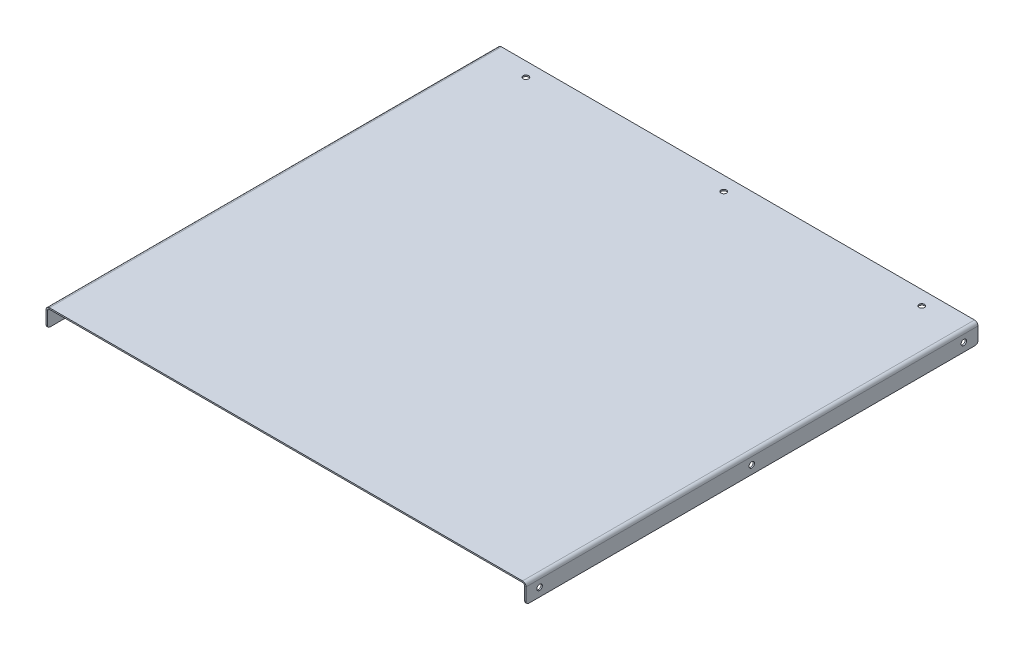
ISO-10303-21;
HEADER;
FILE_DESCRIPTION(('STEP AP214'),'2;1');
FILE_NAME('part.step','',(''),(''),'','','');
FILE_SCHEMA(('AUTOMOTIVE_DESIGN { 1 0 10303 214 1 1 1 1 }'));
ENDSEC;
DATA;
#1=APPLICATION_CONTEXT('core data for automotive mechanical design processes');
#2=APPLICATION_PROTOCOL_DEFINITION('international standard','automotive_design',2000,#1);
#3=PRODUCT_CONTEXT('',#1,'mechanical');
#4=PRODUCT('Part','Part','',(#3));
#5=PRODUCT_RELATED_PRODUCT_CATEGORY('part','',(#4));
#6=PRODUCT_DEFINITION_FORMATION('','',#4);
#7=PRODUCT_DEFINITION_CONTEXT('part definition',#1,'design');
#8=PRODUCT_DEFINITION('design','',#6,#7);
#9=PRODUCT_DEFINITION_SHAPE('','',#8);
#10=(LENGTH_UNIT() NAMED_UNIT(*) SI_UNIT(.MILLI.,.METRE.));
#11=(NAMED_UNIT(*) PLANE_ANGLE_UNIT() SI_UNIT($,.RADIAN.));
#12=(NAMED_UNIT(*) SI_UNIT($,.STERADIAN.) SOLID_ANGLE_UNIT());
#13=UNCERTAINTY_MEASURE_WITH_UNIT(LENGTH_MEASURE(1.E-05),#10,'distance_accuracy_value','');
#14=(GEOMETRIC_REPRESENTATION_CONTEXT(3) GLOBAL_UNCERTAINTY_ASSIGNED_CONTEXT((#13)) GLOBAL_UNIT_ASSIGNED_CONTEXT((#10,
#11,#12)) REPRESENTATION_CONTEXT('',''));
#15=CARTESIAN_POINT('',(0.,0.,0.));
#16=DIRECTION('',(0.,0.,1.));
#17=DIRECTION('',(1.,0.,0.));
#18=AXIS2_PLACEMENT_3D('',#15,#16,#17);
#19=CARTESIAN_POINT('',(-212.4202,0.,0.));
#20=DIRECTION('',(0.,0.,-1.));
#21=DIRECTION('',(-1.,0.,0.));
#22=AXIS2_PLACEMENT_3D('',#19,#20,#21);
#23=PLANE('',#22);
#24=DIRECTION('',(0.,1.,0.));
#25=VECTOR('',#24,1.);
#26=CARTESIAN_POINT('',(-212.4202,0.,0.));
#27=LINE('',#26,#25);
#28=CARTESIAN_POINT('',(-212.4202,0.,0.));
#29=VERTEX_POINT('',#28);
#30=CARTESIAN_POINT('',(-212.4202,1.2192,0.));
#31=VERTEX_POINT('',#30);
#32=EDGE_CURVE('E210',#29,#31,#27,.T.);
#33=ORIENTED_EDGE('',*,*,#32,.F.);
#34=CARTESIAN_POINT('',(-212.4202,-1.905,0.));
#35=DIRECTION('',(0.,0.,1.));
#36=DIRECTION('',(1.,0.,0.));
#37=AXIS2_PLACEMENT_3D('',#34,#35,#36);
#38=CIRCLE('',#37,1.905);
#39=CARTESIAN_POINT('',(-214.3252,-1.905,0.));
#40=VERTEX_POINT('',#39);
#41=EDGE_CURVE('E309',#40,#29,#38,.F.);
#42=ORIENTED_EDGE('',*,*,#41,.F.);
#43=DIRECTION('',(1.,0.,0.));
#44=VECTOR('',#43,1.);
#45=CARTESIAN_POINT('',(-215.5444,-1.905,0.));
#46=LINE('',#45,#44);
#47=CARTESIAN_POINT('',(-215.5444,-1.905,0.));
#48=VERTEX_POINT('',#47);
#49=EDGE_CURVE('E207',#48,#40,#46,.T.);
#50=ORIENTED_EDGE('',*,*,#49,.F.);
#51=CARTESIAN_POINT('',(-212.4202,-1.905,0.));
#52=DIRECTION('',(0.,0.,1.));
#53=DIRECTION('',(1.,0.,0.));
#54=AXIS2_PLACEMENT_3D('',#51,#52,#53);
#55=CIRCLE('',#54,3.1242);
#56=EDGE_CURVE('E302',#48,#31,#55,.F.);
#57=ORIENTED_EDGE('',*,*,#56,.T.);
#58=EDGE_LOOP('',(#33,#42,#50,#57));
#59=FACE_BOUND('',#58,.T.);
#60=ADVANCED_FACE('F36',(#59),#23,.T.);
#61=CARTESIAN_POINT('',(-215.5444,-1.905,0.));
#62=DIRECTION('',(0.,0.,-1.));
#63=DIRECTION('',(-1.,0.,0.));
#64=AXIS2_PLACEMENT_3D('',#61,#62,#63);
#65=PLANE('',#64);
#66=DIRECTION('',(1.,0.,0.));
#67=VECTOR('',#66,1.);
#68=CARTESIAN_POINT('',(-214.3252,0.,0.));
#69=LINE('',#68,#67);
#70=CARTESIAN_POINT('',(212.4202,0.,0.));
#71=VERTEX_POINT('',#70);
#72=EDGE_CURVE('E312',#29,#71,#69,.T.);
#73=ORIENTED_EDGE('',*,*,#72,.F.);
#74=ORIENTED_EDGE('',*,*,#32,.T.);
#75=DIRECTION('',(1.,0.,0.));
#76=VECTOR('',#75,1.);
#77=CARTESIAN_POINT('',(-214.3252,1.2192,0.));
#78=LINE('',#77,#76);
#79=CARTESIAN_POINT('',(212.4202,1.21920000000008,0.));
#80=VERTEX_POINT('',#79);
#81=EDGE_CURVE('E300',#31,#80,#78,.T.);
#82=ORIENTED_EDGE('',*,*,#81,.T.);
#83=DIRECTION('',(0.,-1.,0.));
#84=VECTOR('',#83,1.);
#85=CARTESIAN_POINT('',(212.4202,1.21920000000008,0.));
#86=LINE('',#85,#84);
#87=EDGE_CURVE('E203',#80,#71,#86,.T.);
#88=ORIENTED_EDGE('',*,*,#87,.T.);
#89=EDGE_LOOP('',(#73,#74,#82,#88));
#90=FACE_BOUND('',#89,.T.);
#91=ADVANCED_FACE('F402',(#90),#65,.T.);
#92=CARTESIAN_POINT('',(214.3252,-1.90499999999992,0.));
#93=DIRECTION('',(0.,0.,-1.));
#94=DIRECTION('',(-1.,0.,0.));
#95=AXIS2_PLACEMENT_3D('',#92,#93,#94);
#96=PLANE('',#95);
#97=DIRECTION('',(1.,0.,0.));
#98=VECTOR('',#97,1.);
#99=CARTESIAN_POINT('',(214.3252,-1.90499999999992,0.));
#100=LINE('',#99,#98);
#101=CARTESIAN_POINT('',(214.3252,-1.90499999999992,0.));
#102=VERTEX_POINT('',#101);
#103=CARTESIAN_POINT('',(215.5444,-1.90499999999992,0.));
#104=VERTEX_POINT('',#103);
#105=EDGE_CURVE('E205',#102,#104,#100,.T.);
#106=ORIENTED_EDGE('',*,*,#105,.F.);
#107=CARTESIAN_POINT('',(212.4202,-1.90499999999992,0.));
#108=DIRECTION('',(0.,0.,1.));
#109=DIRECTION('',(1.,0.,0.));
#110=AXIS2_PLACEMENT_3D('',#107,#108,#109);
#111=CIRCLE('',#110,1.905);
#112=EDGE_CURVE('E315',#71,#102,#111,.F.);
#113=ORIENTED_EDGE('',*,*,#112,.F.);
#114=ORIENTED_EDGE('',*,*,#87,.F.);
#115=CARTESIAN_POINT('',(212.4202,-1.90499999999992,0.));
#116=DIRECTION('',(0.,0.,1.));
#117=DIRECTION('',(1.,0.,0.));
#118=AXIS2_PLACEMENT_3D('',#115,#116,#117);
#119=CIRCLE('',#118,3.1242);
#120=EDGE_CURVE('E190',#80,#104,#119,.F.);
#121=ORIENTED_EDGE('',*,*,#120,.T.);
#122=EDGE_LOOP('',(#106,#113,#114,#121));
#123=FACE_BOUND('',#122,.T.);
#124=ADVANCED_FACE('F400',(#123),#96,.T.);
#125=CARTESIAN_POINT('',(212.4202,1.21920000000008,0.));
#126=DIRECTION('',(0.,0.,-1.));
#127=DIRECTION('',(-1.,0.,0.));
#128=AXIS2_PLACEMENT_3D('',#125,#126,#127);
#129=PLANE('',#128);
#130=DIRECTION('',(0.,1.,0.));
#131=VECTOR('',#130,1.);
#132=CARTESIAN_POINT('',(215.5444,0.,0.));
#133=LINE('',#132,#131);
#134=CARTESIAN_POINT('',(215.5444,-13.3349999999999,0.));
#135=VERTEX_POINT('',#134);
#136=EDGE_CURVE('E296',#104,#135,#133,.F.);
#137=ORIENTED_EDGE('',*,*,#136,.T.);
#138=DIRECTION('',(-1.,0.,0.));
#139=VECTOR('',#138,1.);
#140=CARTESIAN_POINT('',(212.4202,-13.3349999999999,0.));
#141=LINE('',#140,#139);
#142=CARTESIAN_POINT('',(214.3252,-13.3349999999999,0.));
#143=VERTEX_POINT('',#142);
#144=EDGE_CURVE('E228',#135,#143,#141,.T.);
#145=ORIENTED_EDGE('',*,*,#144,.T.);
#146=DIRECTION('',(0.,-1.,0.));
#147=VECTOR('',#146,1.);
#148=CARTESIAN_POINT('',(214.3252,0.,0.));
#149=LINE('',#148,#147);
#150=EDGE_CURVE('E293',#102,#143,#149,.T.);
#151=ORIENTED_EDGE('',*,*,#150,.F.);
#152=ORIENTED_EDGE('',*,*,#105,.T.);
#153=EDGE_LOOP('',(#137,#145,#151,#152));
#154=FACE_BOUND('',#153,.T.);
#155=ADVANCED_FACE('F409',(#154),#129,.T.);
#156=CARTESIAN_POINT('',(214.3252,0.,837.827589705481));
#157=DIRECTION('',(1.,0.,0.));
#158=DIRECTION('',(0.,0.,-1.));
#159=AXIS2_PLACEMENT_3D('',#156,#157,#158);
#160=PLANE('',#159);
#161=CARTESIAN_POINT('',(214.3252,-8.30580014757246,12.7));
#162=DIRECTION('',(1.,0.,0.));
#163=DIRECTION('',(0.,0.,-1.));
#164=AXIS2_PLACEMENT_3D('',#161,#162,#163);
#165=CIRCLE('',#164,2.4765);
#166=CARTESIAN_POINT('',(214.3252,-8.30580014757246,10.2235));
#167=VERTEX_POINT('',#166);
#168=EDGE_CURVE('E261',#167,#167,#165,.T.);
#169=ORIENTED_EDGE('',*,*,#168,.T.);
#170=EDGE_LOOP('',(#169));
#171=FACE_BOUND('',#170,.T.);
#172=CARTESIAN_POINT('',(214.3252,-8.30580014757251,203.2));
#173=DIRECTION('',(1.,0.,0.));
#174=DIRECTION('',(0.,0.,-1.));
#175=AXIS2_PLACEMENT_3D('',#172,#173,#174);
#176=CIRCLE('',#175,2.4765);
#177=CARTESIAN_POINT('',(214.3252,-8.30580014757251,200.7235));
#178=VERTEX_POINT('',#177);
#179=EDGE_CURVE('E248',#178,#178,#176,.T.);
#180=ORIENTED_EDGE('',*,*,#179,.T.);
#181=EDGE_LOOP('',(#180));
#182=FACE_BOUND('',#181,.T.);
#183=CARTESIAN_POINT('',(214.3252,-8.30580014757251,393.7));
#184=DIRECTION('',(1.,0.,0.));
#185=DIRECTION('',(0.,0.,-1.));
#186=AXIS2_PLACEMENT_3D('',#183,#184,#185);
#187=CIRCLE('',#186,2.47649999999997);
#188=CARTESIAN_POINT('',(214.3252,-8.30580014757251,391.2235));
#189=VERTEX_POINT('',#188);
#190=EDGE_CURVE('E244',#189,#189,#187,.T.);
#191=ORIENTED_EDGE('',*,*,#190,.T.);
#192=EDGE_LOOP('',(#191));
#193=FACE_BOUND('',#192,.T.);
#194=ORIENTED_EDGE('',*,*,#150,.T.);
#195=CARTESIAN_POINT('',(214.3252,-13.3349999999999,2.54));
#196=DIRECTION('',(1.,0.,0.));
#197=DIRECTION('',(0.,0.,-1.));
#198=AXIS2_PLACEMENT_3D('',#195,#196,#197);
#199=CIRCLE('',#198,2.54);
#200=CARTESIAN_POINT('',(214.3252,-15.8749999999999,2.53999999999999));
#201=VERTEX_POINT('',#200);
#202=EDGE_CURVE('E233',#143,#201,#199,.F.);
#203=ORIENTED_EDGE('',*,*,#202,.T.);
#204=DIRECTION('',(0.,0.,-1.));
#205=VECTOR('',#204,1.);
#206=CARTESIAN_POINT('',(214.3252,-15.8749999999999,837.827589705481));
#207=LINE('',#206,#205);
#208=CARTESIAN_POINT('',(214.3252,-15.8749999999999,403.352000000001));
#209=VERTEX_POINT('',#208);
#210=EDGE_CURVE('E201',#209,#201,#207,.T.);
#211=ORIENTED_EDGE('',*,*,#210,.F.);
#212=CARTESIAN_POINT('',(214.3252,-13.3349999999999,403.352000000001));
#213=DIRECTION('',(1.,0.,0.));
#214=DIRECTION('',(0.,0.,-1.));
#215=AXIS2_PLACEMENT_3D('',#212,#213,#214);
#216=CIRCLE('',#215,2.54);
#217=CARTESIAN_POINT('',(214.3252,-13.3349999999999,405.892000000001));
#218=VERTEX_POINT('',#217);
#219=EDGE_CURVE('E231',#209,#218,#216,.F.);
#220=ORIENTED_EDGE('',*,*,#219,.T.);
#221=DIRECTION('',(0.,1.,0.));
#222=VECTOR('',#221,1.);
#223=CARTESIAN_POINT('',(214.3252,0.,405.892000000001));
#224=LINE('',#223,#222);
#225=CARTESIAN_POINT('',(214.3252,-1.90499999999992,405.892000000001));
#226=VERTEX_POINT('',#225);
#227=EDGE_CURVE('E287',#218,#226,#224,.T.);
#228=ORIENTED_EDGE('',*,*,#227,.T.);
#229=DIRECTION('',(0.,0.,-1.));
#230=VECTOR('',#229,1.);
#231=CARTESIAN_POINT('',(214.3252,-1.90499999999992,837.827589705481));
#232=LINE('',#231,#230);
#233=EDGE_CURVE('E318',#226,#102,#232,.T.);
#234=ORIENTED_EDGE('',*,*,#233,.T.);
#235=EDGE_LOOP('',(#194,#203,#211,#220,#228,#234));
#236=FACE_BOUND('',#235,.T.);
#237=ADVANCED_FACE('F386',(#171,#182,#193,#236),#160,.F.);
#238=CARTESIAN_POINT('',(215.5444,-15.8749999999999,837.827589705481));
#239=DIRECTION('',(0.,-1.,0.));
#240=DIRECTION('',(0.,0.,-1.));
#241=AXIS2_PLACEMENT_3D('',#238,#239,#240);
#242=PLANE('',#241);
#243=ORIENTED_EDGE('',*,*,#210,.T.);
#244=DIRECTION('',(-1.,0.,0.));
#245=VECTOR('',#244,1.);
#246=CARTESIAN_POINT('',(215.5444,-15.8749999999999,2.53999999999999));
#247=LINE('',#246,#245);
#248=CARTESIAN_POINT('',(215.5444,-15.8749999999999,2.53999999999999));
#249=VERTEX_POINT('',#248);
#250=EDGE_CURVE('E61',#201,#249,#247,.F.);
#251=ORIENTED_EDGE('',*,*,#250,.T.);
#252=DIRECTION('',(0.,0.,-1.));
#253=VECTOR('',#252,1.);
#254=CARTESIAN_POINT('',(215.5444,-15.8749999999999,837.827589705481));
#255=LINE('',#254,#253);
#256=CARTESIAN_POINT('',(215.5444,-15.8749999999999,403.352000000001));
#257=VERTEX_POINT('',#256);
#258=EDGE_CURVE('E194',#257,#249,#255,.T.);
#259=ORIENTED_EDGE('',*,*,#258,.F.);
#260=DIRECTION('',(-1.,0.,0.));
#261=VECTOR('',#260,1.);
#262=CARTESIAN_POINT('',(215.5444,-15.8749999999999,403.352000000001));
#263=LINE('',#262,#261);
#264=EDGE_CURVE('E235',#257,#209,#263,.T.);
#265=ORIENTED_EDGE('',*,*,#264,.T.);
#266=EDGE_LOOP('',(#243,#251,#259,#265));
#267=FACE_BOUND('',#266,.T.);
#268=ADVANCED_FACE('F425',(#267),#242,.T.);
#269=CARTESIAN_POINT('',(215.5444,0.,837.827589705481));
#270=DIRECTION('',(1.,0.,0.));
#271=DIRECTION('',(0.,0.,-1.));
#272=AXIS2_PLACEMENT_3D('',#269,#270,#271);
#273=PLANE('',#272);
#274=CARTESIAN_POINT('',(215.5444,-8.30580014757246,12.7));
#275=DIRECTION('',(1.,0.,0.));
#276=DIRECTION('',(0.,0.,-1.));
#277=AXIS2_PLACEMENT_3D('',#274,#275,#276);
#278=CIRCLE('',#277,2.4765);
#279=CARTESIAN_POINT('',(215.5444,-8.30580014757246,10.2235));
#280=VERTEX_POINT('',#279);
#281=EDGE_CURVE('E519',#280,#280,#278,.T.);
#282=ORIENTED_EDGE('',*,*,#281,.F.);
#283=EDGE_LOOP('',(#282));
#284=FACE_BOUND('',#283,.T.);
#285=CARTESIAN_POINT('',(215.5444,-8.30580014757251,203.2));
#286=DIRECTION('',(1.,0.,0.));
#287=DIRECTION('',(0.,0.,-1.));
#288=AXIS2_PLACEMENT_3D('',#285,#286,#287);
#289=CIRCLE('',#288,2.4765);
#290=CARTESIAN_POINT('',(215.5444,-8.30580014757251,200.7235));
#291=VERTEX_POINT('',#290);
#292=EDGE_CURVE('E256',#291,#291,#289,.T.);
#293=ORIENTED_EDGE('',*,*,#292,.F.);
#294=EDGE_LOOP('',(#293));
#295=FACE_BOUND('',#294,.T.);
#296=CARTESIAN_POINT('',(215.5444,-8.30580014757251,393.7));
#297=DIRECTION('',(1.,0.,0.));
#298=DIRECTION('',(0.,0.,-1.));
#299=AXIS2_PLACEMENT_3D('',#296,#297,#298);
#300=CIRCLE('',#299,2.47649999999997);
#301=CARTESIAN_POINT('',(215.5444,-8.30580014757251,391.2235));
#302=VERTEX_POINT('',#301);
#303=EDGE_CURVE('E253',#302,#302,#300,.T.);
#304=ORIENTED_EDGE('',*,*,#303,.F.);
#305=EDGE_LOOP('',(#304));
#306=FACE_BOUND('',#305,.T.);
#307=ORIENTED_EDGE('',*,*,#258,.T.);
#308=CARTESIAN_POINT('',(215.5444,-13.3349999999999,2.54));
#309=DIRECTION('',(1.,0.,0.));
#310=DIRECTION('',(0.,0.,-1.));
#311=AXIS2_PLACEMENT_3D('',#308,#309,#310);
#312=CIRCLE('',#311,2.54);
#313=EDGE_CURVE('E239',#249,#135,#312,.T.);
#314=ORIENTED_EDGE('',*,*,#313,.T.);
#315=ORIENTED_EDGE('',*,*,#136,.F.);
#316=DIRECTION('',(0.,0.,-1.));
#317=VECTOR('',#316,1.);
#318=CARTESIAN_POINT('',(215.5444,-1.90499999999992,837.827589705481));
#319=LINE('',#318,#317);
#320=CARTESIAN_POINT('',(215.5444,-1.90499999999992,405.892000000001));
#321=VERTEX_POINT('',#320);
#322=EDGE_CURVE('E192',#321,#104,#319,.T.);
#323=ORIENTED_EDGE('',*,*,#322,.F.);
#324=DIRECTION('',(0.,1.,0.));
#325=VECTOR('',#324,1.);
#326=CARTESIAN_POINT('',(215.5444,0.,405.892000000001));
#327=LINE('',#326,#325);
#328=CARTESIAN_POINT('',(215.5444,-13.3349999999999,405.892000000001));
#329=VERTEX_POINT('',#328);
#330=EDGE_CURVE('E289',#329,#321,#327,.T.);
#331=ORIENTED_EDGE('',*,*,#330,.F.);
#332=CARTESIAN_POINT('',(215.5444,-13.3349999999999,403.352000000001));
#333=DIRECTION('',(1.,0.,0.));
#334=DIRECTION('',(0.,0.,-1.));
#335=AXIS2_PLACEMENT_3D('',#332,#333,#334);
#336=CIRCLE('',#335,2.54);
#337=EDGE_CURVE('E53',#329,#257,#336,.T.);
#338=ORIENTED_EDGE('',*,*,#337,.T.);
#339=EDGE_LOOP('',(#307,#314,#315,#323,#331,#338));
#340=FACE_BOUND('',#339,.T.);
#341=ADVANCED_FACE('F394',(#284,#295,#306,#340),#273,.T.);
#342=CARTESIAN_POINT('',(212.4202,-1.90499999999992,837.827589705481));
#343=DIRECTION('',(0.,0.,-1.));
#344=DIRECTION('',(-1.,0.,0.));
#345=AXIS2_PLACEMENT_3D('',#342,#343,#344);
#346=CYLINDRICAL_SURFACE('',#345,3.1242);
#347=DIRECTION('',(0.,0.,-1.));
#348=VECTOR('',#347,1.);
#349=CARTESIAN_POINT('',(212.4202,1.21920000000008,837.827589705481));
#350=LINE('',#349,#348);
#351=CARTESIAN_POINT('',(212.4202,1.21920000000008,405.892000000001));
#352=VERTEX_POINT('',#351);
#353=EDGE_CURVE('E183',#352,#80,#350,.T.);
#354=ORIENTED_EDGE('',*,*,#353,.F.);
#355=CARTESIAN_POINT('',(212.4202,-1.90499999999992,405.892000000001));
#356=DIRECTION('',(0.,0.,-1.));
#357=DIRECTION('',(-1.,0.,0.));
#358=AXIS2_PLACEMENT_3D('',#355,#356,#357);
#359=CIRCLE('',#358,3.1242);
#360=EDGE_CURVE('E153',#321,#352,#359,.F.);
#361=ORIENTED_EDGE('',*,*,#360,.F.);
#362=ORIENTED_EDGE('',*,*,#322,.T.);
#363=ORIENTED_EDGE('',*,*,#120,.F.);
#364=EDGE_LOOP('',(#354,#361,#362,#363));
#365=FACE_BOUND('',#364,.T.);
#366=ADVANCED_FACE('F188',(#365),#346,.T.);
#367=CARTESIAN_POINT('',(-214.3252,1.2192,837.827589705481));
#368=DIRECTION('',(0.,1.,0.));
#369=DIRECTION('',(-1.,0.,0.));
#370=AXIS2_PLACEMENT_3D('',#367,#368,#369);
#371=PLANE('',#370);
#372=CARTESIAN_POINT('',(177.8,1.21920000000007,12.7000000000006));
#373=DIRECTION('',(0.,1.,0.));
#374=DIRECTION('',(-1.,0.,0.));
#375=AXIS2_PLACEMENT_3D('',#372,#373,#374);
#376=CIRCLE('',#375,2.4765);
#377=CARTESIAN_POINT('',(175.3235,1.21920000000007,12.7000000000006));
#378=VERTEX_POINT('',#377);
#379=EDGE_CURVE('E505',#378,#378,#376,.T.);
#380=ORIENTED_EDGE('',*,*,#379,.F.);
#381=EDGE_LOOP('',(#380));
#382=FACE_BOUND('',#381,.T.);
#383=CARTESIAN_POINT('',(0.,1.21920000000004,12.7000000000006));
#384=DIRECTION('',(0.,1.,0.));
#385=DIRECTION('',(-1.,0.,0.));
#386=AXIS2_PLACEMENT_3D('',#383,#384,#385);
#387=CIRCLE('',#386,2.4765);
#388=CARTESIAN_POINT('',(-2.47649999999998,1.21920000000004,12.7000000000006));
#389=VERTEX_POINT('',#388);
#390=EDGE_CURVE('E507',#389,#389,#387,.T.);
#391=ORIENTED_EDGE('',*,*,#390,.F.);
#392=EDGE_LOOP('',(#391));
#393=FACE_BOUND('',#392,.T.);
#394=CARTESIAN_POINT('',(-177.8,1.21920000000001,12.7000000000007));
#395=DIRECTION('',(0.,1.,0.));
#396=DIRECTION('',(-1.,0.,0.));
#397=AXIS2_PLACEMENT_3D('',#394,#395,#396);
#398=CIRCLE('',#397,2.4765);
#399=CARTESIAN_POINT('',(-180.2765,1.21920000000001,12.7000000000007));
#400=VERTEX_POINT('',#399);
#401=EDGE_CURVE('E513',#400,#400,#398,.T.);
#402=ORIENTED_EDGE('',*,*,#401,.F.);
#403=EDGE_LOOP('',(#402));
#404=FACE_BOUND('',#403,.T.);
#405=DIRECTION('',(0.,0.,-1.));
#406=VECTOR('',#405,1.);
#407=CARTESIAN_POINT('',(-212.4202,1.2192,837.827589705481));
#408=LINE('',#407,#406);
#409=CARTESIAN_POINT('',(-212.4202,1.2192,405.892000000001));
#410=VERTEX_POINT('',#409);
#411=EDGE_CURVE('E186',#410,#31,#408,.T.);
#412=ORIENTED_EDGE('',*,*,#411,.F.);
#413=DIRECTION('',(-1.,0.,0.));
#414=VECTOR('',#413,1.);
#415=CARTESIAN_POINT('',(-214.3252,1.2192,405.892000000001));
#416=LINE('',#415,#414);
#417=EDGE_CURVE('E171',#352,#410,#416,.T.);
#418=ORIENTED_EDGE('',*,*,#417,.F.);
#419=ORIENTED_EDGE('',*,*,#353,.T.);
#420=ORIENTED_EDGE('',*,*,#81,.F.);
#421=EDGE_LOOP('',(#412,#418,#419,#420));
#422=FACE_BOUND('',#421,.T.);
#423=ADVANCED_FACE('F181',(#382,#393,#404,#422),#371,.T.);
#424=CARTESIAN_POINT('',(-212.4202,-1.905,837.827589705481));
#425=DIRECTION('',(0.,0.,-1.));
#426=DIRECTION('',(-1.,0.,0.));
#427=AXIS2_PLACEMENT_3D('',#424,#425,#426);
#428=CYLINDRICAL_SURFACE('',#427,3.1242);
#429=DIRECTION('',(0.,0.,-1.));
#430=VECTOR('',#429,1.);
#431=CARTESIAN_POINT('',(-215.5444,-1.905,837.827589705481));
#432=LINE('',#431,#430);
#433=CARTESIAN_POINT('',(-215.5444,-1.905,405.892000000001));
#434=VERTEX_POINT('',#433);
#435=EDGE_CURVE('E196',#434,#48,#432,.T.);
#436=ORIENTED_EDGE('',*,*,#435,.F.);
#437=CARTESIAN_POINT('',(-212.4202,-1.905,405.892000000001));
#438=DIRECTION('',(0.,0.,-1.));
#439=DIRECTION('',(-1.,0.,0.));
#440=AXIS2_PLACEMENT_3D('',#437,#438,#439);
#441=CIRCLE('',#440,3.1242);
#442=EDGE_CURVE('E273',#410,#434,#441,.F.);
#443=ORIENTED_EDGE('',*,*,#442,.F.);
#444=ORIENTED_EDGE('',*,*,#411,.T.);
#445=ORIENTED_EDGE('',*,*,#56,.F.);
#446=EDGE_LOOP('',(#436,#443,#444,#445));
#447=FACE_BOUND('',#446,.T.);
#448=ADVANCED_FACE('F344',(#447),#428,.T.);
#449=CARTESIAN_POINT('',(-215.5444,-15.875,837.827589705481));
#450=DIRECTION('',(-1.,0.,0.));
#451=DIRECTION('',(0.,0.,1.));
#452=AXIS2_PLACEMENT_3D('',#449,#450,#451);
#453=PLANE('',#452);
#454=CARTESIAN_POINT('',(-215.5444,-8.30580014757246,12.7));
#455=DIRECTION('',(1.,0.,0.));
#456=DIRECTION('',(0.,0.,-1.));
#457=AXIS2_PLACEMENT_3D('',#454,#455,#456);
#458=CIRCLE('',#457,2.4765);
#459=CARTESIAN_POINT('',(-215.5444,-8.30580014757246,10.2235));
#460=VERTEX_POINT('',#459);
#461=EDGE_CURVE('E522',#460,#460,#458,.T.);
#462=ORIENTED_EDGE('',*,*,#461,.T.);
#463=EDGE_LOOP('',(#462));
#464=FACE_BOUND('',#463,.T.);
#465=CARTESIAN_POINT('',(-215.5444,-8.30580014757251,203.2));
#466=DIRECTION('',(1.,0.,0.));
#467=DIRECTION('',(0.,0.,-1.));
#468=AXIS2_PLACEMENT_3D('',#465,#466,#467);
#469=CIRCLE('',#468,2.4765);
#470=CARTESIAN_POINT('',(-215.5444,-8.30580014757251,200.7235));
#471=VERTEX_POINT('',#470);
#472=EDGE_CURVE('E249',#471,#471,#469,.T.);
#473=ORIENTED_EDGE('',*,*,#472,.T.);
#474=EDGE_LOOP('',(#473));
#475=FACE_BOUND('',#474,.T.);
#476=CARTESIAN_POINT('',(-215.5444,-8.30580014757251,393.7));
#477=DIRECTION('',(1.,0.,0.));
#478=DIRECTION('',(0.,0.,-1.));
#479=AXIS2_PLACEMENT_3D('',#476,#477,#478);
#480=CIRCLE('',#479,2.47649999999997);
#481=CARTESIAN_POINT('',(-215.5444,-8.30580014757251,391.2235));
#482=VERTEX_POINT('',#481);
#483=EDGE_CURVE('E245',#482,#482,#480,.T.);
#484=ORIENTED_EDGE('',*,*,#483,.T.);
#485=EDGE_LOOP('',(#484));
#486=FACE_BOUND('',#485,.T.);
#487=DIRECTION('',(0.,1.,0.));
#488=VECTOR('',#487,1.);
#489=CARTESIAN_POINT('',(-215.5444,-15.875,0.));
#490=LINE('',#489,#488);
#491=CARTESIAN_POINT('',(-215.5444,-13.335,0.));
#492=VERTEX_POINT('',#491);
#493=EDGE_CURVE('E305',#492,#48,#490,.T.);
#494=ORIENTED_EDGE('',*,*,#493,.F.);
#495=CARTESIAN_POINT('',(-215.5444,-13.335,2.54));
#496=DIRECTION('',(-1.,0.,0.));
#497=DIRECTION('',(0.,0.,1.));
#498=AXIS2_PLACEMENT_3D('',#495,#496,#497);
#499=CIRCLE('',#498,2.54);
#500=CARTESIAN_POINT('',(-215.5444,-15.875,2.53999999999999));
#501=VERTEX_POINT('',#500);
#502=EDGE_CURVE('E217',#492,#501,#499,.T.);
#503=ORIENTED_EDGE('',*,*,#502,.T.);
#504=DIRECTION('',(0.,0.,-1.));
#505=VECTOR('',#504,1.);
#506=CARTESIAN_POINT('',(-215.5444,-15.875,837.827589705481));
#507=LINE('',#506,#505);
#508=CARTESIAN_POINT('',(-215.5444,-15.875,403.352000000001));
#509=VERTEX_POINT('',#508);
#510=EDGE_CURVE('E333',#509,#501,#507,.T.);
#511=ORIENTED_EDGE('',*,*,#510,.F.);
#512=CARTESIAN_POINT('',(-215.5444,-13.335,403.352000000001));
#513=DIRECTION('',(-1.,0.,0.));
#514=DIRECTION('',(0.,0.,1.));
#515=AXIS2_PLACEMENT_3D('',#512,#513,#514);
#516=CIRCLE('',#515,2.54);
#517=CARTESIAN_POINT('',(-215.5444,-13.335,405.892000000001));
#518=VERTEX_POINT('',#517);
#519=EDGE_CURVE('E215',#509,#518,#516,.T.);
#520=ORIENTED_EDGE('',*,*,#519,.T.);
#521=DIRECTION('',(0.,1.,0.));
#522=VECTOR('',#521,1.);
#523=CARTESIAN_POINT('',(-215.5444,-15.875,405.892000000001));
#524=LINE('',#523,#522);
#525=EDGE_CURVE('E278',#434,#518,#524,.F.);
#526=ORIENTED_EDGE('',*,*,#525,.F.);
#527=ORIENTED_EDGE('',*,*,#435,.T.);
#528=EDGE_LOOP('',(#494,#503,#511,#520,#526,#527));
#529=FACE_BOUND('',#528,.T.);
#530=ADVANCED_FACE('F341',(#464,#475,#486,#529),#453,.T.);
#531=CARTESIAN_POINT('',(-214.3252,-15.875,837.827589705481));
#532=DIRECTION('',(0.,-1.,0.));
#533=DIRECTION('',(0.,0.,-1.));
#534=AXIS2_PLACEMENT_3D('',#531,#532,#533);
#535=PLANE('',#534);
#536=ORIENTED_EDGE('',*,*,#510,.T.);
#537=DIRECTION('',(-1.,0.,0.));
#538=VECTOR('',#537,1.);
#539=CARTESIAN_POINT('',(-214.3252,-15.875,2.54));
#540=LINE('',#539,#538);
#541=CARTESIAN_POINT('',(-214.3252,-15.875,2.53999999999999));
#542=VERTEX_POINT('',#541);
#543=EDGE_CURVE('E222',#501,#542,#540,.F.);
#544=ORIENTED_EDGE('',*,*,#543,.T.);
#545=DIRECTION('',(0.,0.,-1.));
#546=VECTOR('',#545,1.);
#547=CARTESIAN_POINT('',(-214.3252,-15.875,837.827589705481));
#548=LINE('',#547,#546);
#549=CARTESIAN_POINT('',(-214.3252,-15.875,403.352000000001));
#550=VERTEX_POINT('',#549);
#551=EDGE_CURVE('E330',#550,#542,#548,.T.);
#552=ORIENTED_EDGE('',*,*,#551,.F.);
#553=DIRECTION('',(1.,0.,0.));
#554=VECTOR('',#553,1.);
#555=CARTESIAN_POINT('',(-214.3252,-15.875,403.352000000001));
#556=LINE('',#555,#554);
#557=EDGE_CURVE('E219',#550,#509,#556,.F.);
#558=ORIENTED_EDGE('',*,*,#557,.T.);
#559=EDGE_LOOP('',(#536,#544,#552,#558));
#560=FACE_BOUND('',#559,.T.);
#561=ADVANCED_FACE('F368',(#560),#535,.T.);
#562=CARTESIAN_POINT('',(-214.3252,-15.875,837.827589705481));
#563=DIRECTION('',(-1.,0.,0.));
#564=DIRECTION('',(0.,0.,1.));
#565=AXIS2_PLACEMENT_3D('',#562,#563,#564);
#566=PLANE('',#565);
#567=CARTESIAN_POINT('',(-214.3252,-8.30580014757246,12.7));
#568=DIRECTION('',(-1.,0.,0.));
#569=DIRECTION('',(0.,0.,1.));
#570=AXIS2_PLACEMENT_3D('',#567,#568,#569);
#571=CIRCLE('',#570,2.4765);
#572=CARTESIAN_POINT('',(-214.3252,-8.30580014757246,15.1765));
#573=VERTEX_POINT('',#572);
#574=EDGE_CURVE('E40',#573,#573,#571,.T.);
#575=ORIENTED_EDGE('',*,*,#574,.T.);
#576=EDGE_LOOP('',(#575));
#577=FACE_BOUND('',#576,.T.);
#578=CARTESIAN_POINT('',(-214.3252,-8.30580014757251,203.2));
#579=DIRECTION('',(-1.,0.,0.));
#580=DIRECTION('',(0.,0.,1.));
#581=AXIS2_PLACEMENT_3D('',#578,#579,#580);
#582=CIRCLE('',#581,2.4765);
#583=CARTESIAN_POINT('',(-214.3252,-8.30580014757251,205.6765));
#584=VERTEX_POINT('',#583);
#585=EDGE_CURVE('E246',#584,#584,#582,.T.);
#586=ORIENTED_EDGE('',*,*,#585,.T.);
#587=EDGE_LOOP('',(#586));
#588=FACE_BOUND('',#587,.T.);
#589=CARTESIAN_POINT('',(-214.3252,-8.30580014757251,393.7));
#590=DIRECTION('',(-1.,0.,0.));
#591=DIRECTION('',(0.,0.,1.));
#592=AXIS2_PLACEMENT_3D('',#589,#590,#591);
#593=CIRCLE('',#592,2.47649999999997);
#594=CARTESIAN_POINT('',(-214.3252,-8.30580014757251,396.1765));
#595=VERTEX_POINT('',#594);
#596=EDGE_CURVE('E242',#595,#595,#593,.T.);
#597=ORIENTED_EDGE('',*,*,#596,.T.);
#598=EDGE_LOOP('',(#597));
#599=FACE_BOUND('',#598,.T.);
#600=ORIENTED_EDGE('',*,*,#551,.T.);
#601=CARTESIAN_POINT('',(-214.3252,-13.335,2.54));
#602=DIRECTION('',(-1.,0.,0.));
#603=DIRECTION('',(0.,0.,1.));
#604=AXIS2_PLACEMENT_3D('',#601,#602,#603);
#605=CIRCLE('',#604,2.54);
#606=CARTESIAN_POINT('',(-214.3252,-13.335,0.));
#607=VERTEX_POINT('',#606);
#608=EDGE_CURVE('E226',#542,#607,#605,.F.);
#609=ORIENTED_EDGE('',*,*,#608,.T.);
#610=DIRECTION('',(0.,1.,0.));
#611=VECTOR('',#610,1.);
#612=CARTESIAN_POINT('',(-214.3252,-15.875,0.));
#613=LINE('',#612,#611);
#614=EDGE_CURVE('E307',#607,#40,#613,.T.);
#615=ORIENTED_EDGE('',*,*,#614,.T.);
#616=DIRECTION('',(0.,0.,-1.));
#617=VECTOR('',#616,1.);
#618=CARTESIAN_POINT('',(-214.3252,-1.905,837.827589705481));
#619=LINE('',#618,#617);
#620=CARTESIAN_POINT('',(-214.3252,-1.905,405.892000000001));
#621=VERTEX_POINT('',#620);
#622=EDGE_CURVE('E327',#621,#40,#619,.T.);
#623=ORIENTED_EDGE('',*,*,#622,.F.);
#624=DIRECTION('',(0.,-1.,0.));
#625=VECTOR('',#624,1.);
#626=CARTESIAN_POINT('',(-214.3252,-15.875,405.892000000001));
#627=LINE('',#626,#625);
#628=CARTESIAN_POINT('',(-214.3252,-13.335,405.892000000001));
#629=VERTEX_POINT('',#628);
#630=EDGE_CURVE('E275',#621,#629,#627,.T.);
#631=ORIENTED_EDGE('',*,*,#630,.T.);
#632=CARTESIAN_POINT('',(-214.3252,-13.335,403.352000000001));
#633=DIRECTION('',(-1.,0.,0.));
#634=DIRECTION('',(0.,0.,1.));
#635=AXIS2_PLACEMENT_3D('',#632,#633,#634);
#636=CIRCLE('',#635,2.54);
#637=EDGE_CURVE('E224',#629,#550,#636,.F.);
#638=ORIENTED_EDGE('',*,*,#637,.T.);
#639=EDGE_LOOP('',(#600,#609,#615,#623,#631,#638));
#640=FACE_BOUND('',#639,.T.);
#641=ADVANCED_FACE('F359',(#577,#588,#599,#640),#566,.F.);
#642=CARTESIAN_POINT('',(-212.4202,-1.905,837.827589705481));
#643=DIRECTION('',(0.,0.,-1.));
#644=DIRECTION('',(-1.,0.,0.));
#645=AXIS2_PLACEMENT_3D('',#642,#643,#644);
#646=CYLINDRICAL_SURFACE('',#645,1.905);
#647=CARTESIAN_POINT('',(-212.4202,-1.905,405.892000000001));
#648=DIRECTION('',(0.,0.,-1.));
#649=DIRECTION('',(-1.,0.,0.));
#650=AXIS2_PLACEMENT_3D('',#647,#648,#649);
#651=CIRCLE('',#650,1.905);
#652=CARTESIAN_POINT('',(-212.4202,0.,405.892000000001));
#653=VERTEX_POINT('',#652);
#654=EDGE_CURVE('E165',#653,#621,#651,.F.);
#655=ORIENTED_EDGE('',*,*,#654,.T.);
#656=ORIENTED_EDGE('',*,*,#622,.T.);
#657=ORIENTED_EDGE('',*,*,#41,.T.);
#658=DIRECTION('',(0.,0.,-1.));
#659=VECTOR('',#658,1.);
#660=CARTESIAN_POINT('',(-212.4202,0.,837.827589705481));
#661=LINE('',#660,#659);
#662=EDGE_CURVE('E324',#653,#29,#661,.T.);
#663=ORIENTED_EDGE('',*,*,#662,.F.);
#664=EDGE_LOOP('',(#655,#656,#657,#663));
#665=FACE_BOUND('',#664,.T.);
#666=ADVANCED_FACE('F354',(#665),#646,.F.);
#667=CARTESIAN_POINT('',(-214.3252,0.,837.827589705481));
#668=DIRECTION('',(0.,1.,0.));
#669=DIRECTION('',(-1.,0.,0.));
#670=AXIS2_PLACEMENT_3D('',#667,#668,#669);
#671=PLANE('',#670);
#672=CARTESIAN_POINT('',(177.8,0.,12.7000000000006));
#673=DIRECTION('',(0.,1.,0.));
#674=DIRECTION('',(-1.,0.,0.));
#675=AXIS2_PLACEMENT_3D('',#672,#673,#674);
#676=CIRCLE('',#675,2.4765);
#677=CARTESIAN_POINT('',(175.3235,0.,12.7000000000006));
#678=VERTEX_POINT('',#677);
#679=EDGE_CURVE('E502',#678,#678,#676,.T.);
#680=ORIENTED_EDGE('',*,*,#679,.T.);
#681=EDGE_LOOP('',(#680));
#682=FACE_BOUND('',#681,.T.);
#683=CARTESIAN_POINT('',(0.,0.,12.7000000000006));
#684=DIRECTION('',(0.,1.,0.));
#685=DIRECTION('',(-1.,0.,0.));
#686=AXIS2_PLACEMENT_3D('',#683,#684,#685);
#687=CIRCLE('',#686,2.4765);
#688=CARTESIAN_POINT('',(-2.47649999999998,0.,12.7000000000006));
#689=VERTEX_POINT('',#688);
#690=EDGE_CURVE('E510',#689,#689,#687,.T.);
#691=ORIENTED_EDGE('',*,*,#690,.T.);
#692=EDGE_LOOP('',(#691));
#693=FACE_BOUND('',#692,.T.);
#694=CARTESIAN_POINT('',(-177.8,0.,12.7000000000007));
#695=DIRECTION('',(0.,1.,0.));
#696=DIRECTION('',(-1.,0.,0.));
#697=AXIS2_PLACEMENT_3D('',#694,#695,#696);
#698=CIRCLE('',#697,2.4765);
#699=CARTESIAN_POINT('',(-180.2765,0.,12.7000000000007));
#700=VERTEX_POINT('',#699);
#701=EDGE_CURVE('E516',#700,#700,#698,.T.);
#702=ORIENTED_EDGE('',*,*,#701,.T.);
#703=EDGE_LOOP('',(#702));
#704=FACE_BOUND('',#703,.T.);
#705=DIRECTION('',(-1.,0.,0.));
#706=VECTOR('',#705,1.);
#707=CARTESIAN_POINT('',(-214.3252,0.,405.892000000001));
#708=LINE('',#707,#706);
#709=CARTESIAN_POINT('',(212.4202,0.,405.892000000001));
#710=VERTEX_POINT('',#709);
#711=EDGE_CURVE('E174',#710,#653,#708,.T.);
#712=ORIENTED_EDGE('',*,*,#711,.T.);
#713=ORIENTED_EDGE('',*,*,#662,.T.);
#714=ORIENTED_EDGE('',*,*,#72,.T.);
#715=DIRECTION('',(0.,0.,-1.));
#716=VECTOR('',#715,1.);
#717=CARTESIAN_POINT('',(212.4202,0.,837.827589705481));
#718=LINE('',#717,#716);
#719=EDGE_CURVE('E321',#710,#71,#718,.T.);
#720=ORIENTED_EDGE('',*,*,#719,.F.);
#721=EDGE_LOOP('',(#712,#713,#714,#720));
#722=FACE_BOUND('',#721,.T.);
#723=ADVANCED_FACE('F379',(#682,#693,#704,#722),#671,.F.);
#724=CARTESIAN_POINT('',(212.4202,-1.90499999999992,837.827589705481));
#725=DIRECTION('',(0.,0.,-1.));
#726=DIRECTION('',(-1.,0.,0.));
#727=AXIS2_PLACEMENT_3D('',#724,#725,#726);
#728=CYLINDRICAL_SURFACE('',#727,1.905);
#729=CARTESIAN_POINT('',(212.4202,-1.90499999999992,405.892000000001));
#730=DIRECTION('',(0.,0.,-1.));
#731=DIRECTION('',(-1.,0.,0.));
#732=AXIS2_PLACEMENT_3D('',#729,#730,#731);
#733=CIRCLE('',#732,1.905);
#734=EDGE_CURVE('E166',#226,#710,#733,.F.);
#735=ORIENTED_EDGE('',*,*,#734,.T.);
#736=ORIENTED_EDGE('',*,*,#719,.T.);
#737=ORIENTED_EDGE('',*,*,#112,.T.);
#738=ORIENTED_EDGE('',*,*,#233,.F.);
#739=EDGE_LOOP('',(#735,#736,#737,#738));
#740=FACE_BOUND('',#739,.T.);
#741=ADVANCED_FACE('F382',(#740),#728,.F.);
#742=CARTESIAN_POINT('',(212.4202,-1.90499999999992,0.));
#743=DIRECTION('',(0.,0.,1.));
#744=DIRECTION('',(1.,0.,0.));
#745=AXIS2_PLACEMENT_3D('',#742,#743,#744);
#746=PLANE('',#745);
#747=ORIENTED_EDGE('',*,*,#614,.F.);
#748=DIRECTION('',(-1.,0.,0.));
#749=VECTOR('',#748,1.);
#750=CARTESIAN_POINT('',(-215.5444,-13.335,0.));
#751=LINE('',#750,#749);
#752=EDGE_CURVE('E212',#607,#492,#751,.T.);
#753=ORIENTED_EDGE('',*,*,#752,.T.);
#754=ORIENTED_EDGE('',*,*,#493,.T.);
#755=ORIENTED_EDGE('',*,*,#49,.T.);
#756=EDGE_LOOP('',(#747,#753,#754,#755));
#757=FACE_BOUND('',#756,.T.);
#758=ADVANCED_FACE('F350',(#757),#746,.F.);
#759=CARTESIAN_POINT('',(214.3252,0.,405.892000000001));
#760=DIRECTION('',(0.,0.,-1.));
#761=DIRECTION('',(0.,1.,0.));
#762=AXIS2_PLACEMENT_3D('',#759,#760,#761);
#763=PLANE('',#762);
#764=ORIENTED_EDGE('',*,*,#227,.F.);
#765=DIRECTION('',(1.,0.,0.));
#766=VECTOR('',#765,1.);
#767=CARTESIAN_POINT('',(214.3252,-13.3349999999999,405.892000000001));
#768=LINE('',#767,#766);
#769=EDGE_CURVE('E45',#218,#329,#768,.T.);
#770=ORIENTED_EDGE('',*,*,#769,.T.);
#771=ORIENTED_EDGE('',*,*,#330,.T.);
#772=DIRECTION('',(-1.,0.,0.));
#773=VECTOR('',#772,1.);
#774=CARTESIAN_POINT('',(214.3252,-1.90499999999992,405.892000000001));
#775=LINE('',#774,#773);
#776=EDGE_CURVE('E160',#226,#321,#775,.F.);
#777=ORIENTED_EDGE('',*,*,#776,.F.);
#778=EDGE_LOOP('',(#764,#770,#771,#777));
#779=FACE_BOUND('',#778,.T.);
#780=ADVANCED_FACE('F391',(#779),#763,.F.);
#781=CARTESIAN_POINT('',(-214.3252,0.,405.892000000001));
#782=DIRECTION('',(0.,0.,-1.));
#783=DIRECTION('',(-1.,0.,0.));
#784=AXIS2_PLACEMENT_3D('',#781,#782,#783);
#785=PLANE('',#784);
#786=DIRECTION('',(0.,-1.,0.));
#787=VECTOR('',#786,1.);
#788=CARTESIAN_POINT('',(-212.4202,0.,405.892000000001));
#789=LINE('',#788,#787);
#790=EDGE_CURVE('E176',#653,#410,#789,.F.);
#791=ORIENTED_EDGE('',*,*,#790,.F.);
#792=ORIENTED_EDGE('',*,*,#711,.F.);
#793=DIRECTION('',(0.,-1.,0.));
#794=VECTOR('',#793,1.);
#795=CARTESIAN_POINT('',(212.4202,0.,405.892000000001));
#796=LINE('',#795,#794);
#797=EDGE_CURVE('E157',#710,#352,#796,.F.);
#798=ORIENTED_EDGE('',*,*,#797,.T.);
#799=ORIENTED_EDGE('',*,*,#417,.T.);
#800=EDGE_LOOP('',(#791,#792,#798,#799));
#801=FACE_BOUND('',#800,.T.);
#802=ADVANCED_FACE('F170',(#801),#785,.F.);
#803=CARTESIAN_POINT('',(-214.3252,-15.875,405.892000000001));
#804=DIRECTION('',(0.,0.,-1.));
#805=DIRECTION('',(0.,-1.,0.));
#806=AXIS2_PLACEMENT_3D('',#803,#804,#805);
#807=PLANE('',#806);
#808=ORIENTED_EDGE('',*,*,#525,.T.);
#809=DIRECTION('',(-1.,0.,0.));
#810=VECTOR('',#809,1.);
#811=CARTESIAN_POINT('',(-214.3252,-13.335,405.892000000001));
#812=LINE('',#811,#810);
#813=EDGE_CURVE('E11',#518,#629,#812,.F.);
#814=ORIENTED_EDGE('',*,*,#813,.T.);
#815=ORIENTED_EDGE('',*,*,#630,.F.);
#816=DIRECTION('',(1.,0.,0.));
#817=VECTOR('',#816,1.);
#818=CARTESIAN_POINT('',(-214.3252,-1.905,405.892000000001));
#819=LINE('',#818,#817);
#820=EDGE_CURVE('E281',#621,#434,#819,.F.);
#821=ORIENTED_EDGE('',*,*,#820,.T.);
#822=EDGE_LOOP('',(#808,#814,#815,#821));
#823=FACE_BOUND('',#822,.T.);
#824=ADVANCED_FACE('F373',(#823),#807,.F.);
#825=CARTESIAN_POINT('',(-212.4202,-1.905,405.892000000001));
#826=DIRECTION('',(0.,0.,1.));
#827=DIRECTION('',(1.,0.,0.));
#828=AXIS2_PLACEMENT_3D('',#825,#826,#827);
#829=PLANE('',#828);
#830=ORIENTED_EDGE('',*,*,#820,.F.);
#831=ORIENTED_EDGE('',*,*,#654,.F.);
#832=ORIENTED_EDGE('',*,*,#790,.T.);
#833=ORIENTED_EDGE('',*,*,#442,.T.);
#834=EDGE_LOOP('',(#830,#831,#832,#833));
#835=FACE_BOUND('',#834,.T.);
#836=ADVANCED_FACE('F376',(#835),#829,.T.);
#837=CARTESIAN_POINT('',(212.4202,-1.90499999999992,405.892000000001));
#838=DIRECTION('',(0.,0.,1.));
#839=DIRECTION('',(1.,0.,0.));
#840=AXIS2_PLACEMENT_3D('',#837,#838,#839);
#841=PLANE('',#840);
#842=ORIENTED_EDGE('',*,*,#797,.F.);
#843=ORIENTED_EDGE('',*,*,#734,.F.);
#844=ORIENTED_EDGE('',*,*,#776,.T.);
#845=ORIENTED_EDGE('',*,*,#360,.T.);
#846=EDGE_LOOP('',(#842,#843,#844,#845));
#847=FACE_BOUND('',#846,.T.);
#848=ADVANCED_FACE('F155',(#847),#841,.T.);
#849=CARTESIAN_POINT('',(212.4202,-13.335,2.54));
#850=DIRECTION('',(1.,0.,0.));
#851=DIRECTION('',(0.,0.,-1.));
#852=AXIS2_PLACEMENT_3D('',#849,#850,#851);
#853=CYLINDRICAL_SURFACE('',#852,2.54);
#854=ORIENTED_EDGE('',*,*,#608,.F.);
#855=ORIENTED_EDGE('',*,*,#543,.F.);
#856=ORIENTED_EDGE('',*,*,#502,.F.);
#857=ORIENTED_EDGE('',*,*,#752,.F.);
#858=EDGE_LOOP('',(#854,#855,#856,#857));
#859=FACE_BOUND('',#858,.T.);
#860=ADVANCED_FACE('F365',(#859),#853,.T.);
#861=CARTESIAN_POINT('',(212.4202,-13.3349999999999,2.54));
#862=DIRECTION('',(-1.,0.,0.));
#863=DIRECTION('',(0.,0.,1.));
#864=AXIS2_PLACEMENT_3D('',#861,#862,#863);
#865=CYLINDRICAL_SURFACE('',#864,2.54);
#866=ORIENTED_EDGE('',*,*,#313,.F.);
#867=ORIENTED_EDGE('',*,*,#250,.F.);
#868=ORIENTED_EDGE('',*,*,#202,.F.);
#869=ORIENTED_EDGE('',*,*,#144,.F.);
#870=EDGE_LOOP('',(#866,#867,#868,#869));
#871=FACE_BOUND('',#870,.T.);
#872=ADVANCED_FACE('F416',(#871),#865,.T.);
#873=CARTESIAN_POINT('',(214.3252,-13.3349999999999,403.352000000001));
#874=DIRECTION('',(-1.,0.,0.));
#875=DIRECTION('',(0.,0.,1.));
#876=AXIS2_PLACEMENT_3D('',#873,#874,#875);
#877=CYLINDRICAL_SURFACE('',#876,2.54);
#878=ORIENTED_EDGE('',*,*,#219,.F.);
#879=ORIENTED_EDGE('',*,*,#264,.F.);
#880=ORIENTED_EDGE('',*,*,#337,.F.);
#881=ORIENTED_EDGE('',*,*,#769,.F.);
#882=EDGE_LOOP('',(#878,#879,#880,#881));
#883=FACE_BOUND('',#882,.T.);
#884=ADVANCED_FACE('F418',(#883),#877,.T.);
#885=CARTESIAN_POINT('',(-214.3252,-13.335,403.352000000001));
#886=DIRECTION('',(1.,0.,0.));
#887=DIRECTION('',(0.,0.,-1.));
#888=AXIS2_PLACEMENT_3D('',#885,#886,#887);
#889=CYLINDRICAL_SURFACE('',#888,2.54);
#890=ORIENTED_EDGE('',*,*,#637,.F.);
#891=ORIENTED_EDGE('',*,*,#813,.F.);
#892=ORIENTED_EDGE('',*,*,#519,.F.);
#893=ORIENTED_EDGE('',*,*,#557,.F.);
#894=EDGE_LOOP('',(#890,#891,#892,#893));
#895=FACE_BOUND('',#894,.T.);
#896=ADVANCED_FACE('F38',(#895),#889,.T.);
#897=CARTESIAN_POINT('',(-215.5444,-8.30580014757251,393.7));
#898=DIRECTION('',(1.,0.,0.));
#899=DIRECTION('',(0.,0.,-1.));
#900=AXIS2_PLACEMENT_3D('',#897,#898,#899);
#901=CYLINDRICAL_SURFACE('',#900,2.47649999999997);
#902=ORIENTED_EDGE('',*,*,#483,.F.);
#903=EDGE_LOOP('',(#902));
#904=FACE_BOUND('',#903,.T.);
#905=ORIENTED_EDGE('',*,*,#596,.F.);
#906=EDGE_LOOP('',(#905));
#907=FACE_BOUND('',#906,.T.);
#908=ADVANCED_FACE('F424',(#904,#907),#901,.F.);
#909=ORIENTED_EDGE('',*,*,#303,.T.);
#910=EDGE_LOOP('',(#909));
#911=FACE_BOUND('',#910,.T.);
#912=ORIENTED_EDGE('',*,*,#190,.F.);
#913=EDGE_LOOP('',(#912));
#914=FACE_BOUND('',#913,.T.);
#915=ADVANCED_FACE('F472',(#911,#914),#901,.F.);
#916=CARTESIAN_POINT('',(-215.5444,-8.30580014757251,203.2));
#917=DIRECTION('',(1.,0.,0.));
#918=DIRECTION('',(0.,0.,-1.));
#919=AXIS2_PLACEMENT_3D('',#916,#917,#918);
#920=CYLINDRICAL_SURFACE('',#919,2.4765);
#921=ORIENTED_EDGE('',*,*,#472,.F.);
#922=EDGE_LOOP('',(#921));
#923=FACE_BOUND('',#922,.T.);
#924=ORIENTED_EDGE('',*,*,#585,.F.);
#925=EDGE_LOOP('',(#924));
#926=FACE_BOUND('',#925,.T.);
#927=ADVANCED_FACE('F475',(#923,#926),#920,.F.);
#928=ORIENTED_EDGE('',*,*,#292,.T.);
#929=EDGE_LOOP('',(#928));
#930=FACE_BOUND('',#929,.T.);
#931=ORIENTED_EDGE('',*,*,#179,.F.);
#932=EDGE_LOOP('',(#931));
#933=FACE_BOUND('',#932,.T.);
#934=ADVANCED_FACE('F477',(#930,#933),#920,.F.);
#935=CARTESIAN_POINT('',(-215.5444,-8.30580014757246,12.7));
#936=DIRECTION('',(1.,0.,0.));
#937=DIRECTION('',(0.,0.,-1.));
#938=AXIS2_PLACEMENT_3D('',#935,#936,#937);
#939=CYLINDRICAL_SURFACE('',#938,2.4765);
#940=ORIENTED_EDGE('',*,*,#461,.F.);
#941=EDGE_LOOP('',(#940));
#942=FACE_BOUND('',#941,.T.);
#943=ORIENTED_EDGE('',*,*,#574,.F.);
#944=EDGE_LOOP('',(#943));
#945=FACE_BOUND('',#944,.T.);
#946=ADVANCED_FACE('F480',(#942,#945),#939,.F.);
#947=ORIENTED_EDGE('',*,*,#281,.T.);
#948=EDGE_LOOP('',(#947));
#949=FACE_BOUND('',#948,.T.);
#950=ORIENTED_EDGE('',*,*,#168,.F.);
#951=EDGE_LOOP('',(#950));
#952=FACE_BOUND('',#951,.T.);
#953=ADVANCED_FACE('F482',(#949,#952),#939,.F.);
#954=CARTESIAN_POINT('',(-177.8,0.,12.7000000000007));
#955=DIRECTION('',(0.,1.,0.));
#956=DIRECTION('',(-1.,0.,0.));
#957=AXIS2_PLACEMENT_3D('',#954,#955,#956);
#958=CYLINDRICAL_SURFACE('',#957,2.4765);
#959=ORIENTED_EDGE('',*,*,#701,.F.);
#960=EDGE_LOOP('',(#959));
#961=FACE_BOUND('',#960,.T.);
#962=ORIENTED_EDGE('',*,*,#401,.T.);
#963=EDGE_LOOP('',(#962));
#964=FACE_BOUND('',#963,.T.);
#965=ADVANCED_FACE('F485',(#961,#964),#958,.F.);
#966=CARTESIAN_POINT('',(0.,0.,12.7000000000006));
#967=DIRECTION('',(0.,1.,0.));
#968=DIRECTION('',(-1.,0.,0.));
#969=AXIS2_PLACEMENT_3D('',#966,#967,#968);
#970=CYLINDRICAL_SURFACE('',#969,2.4765);
#971=ORIENTED_EDGE('',*,*,#690,.F.);
#972=EDGE_LOOP('',(#971));
#973=FACE_BOUND('',#972,.T.);
#974=ORIENTED_EDGE('',*,*,#390,.T.);
#975=EDGE_LOOP('',(#974));
#976=FACE_BOUND('',#975,.T.);
#977=ADVANCED_FACE('F489',(#973,#976),#970,.F.);
#978=CARTESIAN_POINT('',(177.8,0.,12.7000000000006));
#979=DIRECTION('',(0.,1.,0.));
#980=DIRECTION('',(-1.,0.,0.));
#981=AXIS2_PLACEMENT_3D('',#978,#979,#980);
#982=CYLINDRICAL_SURFACE('',#981,2.4765);
#983=ORIENTED_EDGE('',*,*,#679,.F.);
#984=EDGE_LOOP('',(#983));
#985=FACE_BOUND('',#984,.T.);
#986=ORIENTED_EDGE('',*,*,#379,.T.);
#987=EDGE_LOOP('',(#986));
#988=FACE_BOUND('',#987,.T.);
#989=ADVANCED_FACE('F493',(#985,#988),#982,.F.);
#990=CLOSED_SHELL('',(#60,#91,#124,#155,#237,#268,#341,#366,#423,#448,#530,#561,#641,#666,#723,
#741,#758,#780,#802,#824,#836,#848,#860,#872,#884,#896,#908,#915,#927,#934,#946,#953,#965,#977,#989));
#991=MANIFOLD_SOLID_BREP('B2',#990);
#992=ADVANCED_BREP_SHAPE_REPRESENTATION('',(#18,#991),#14);
#993=SHAPE_DEFINITION_REPRESENTATION(#9,#992);
ENDSEC;
END-ISO-10303-21;
